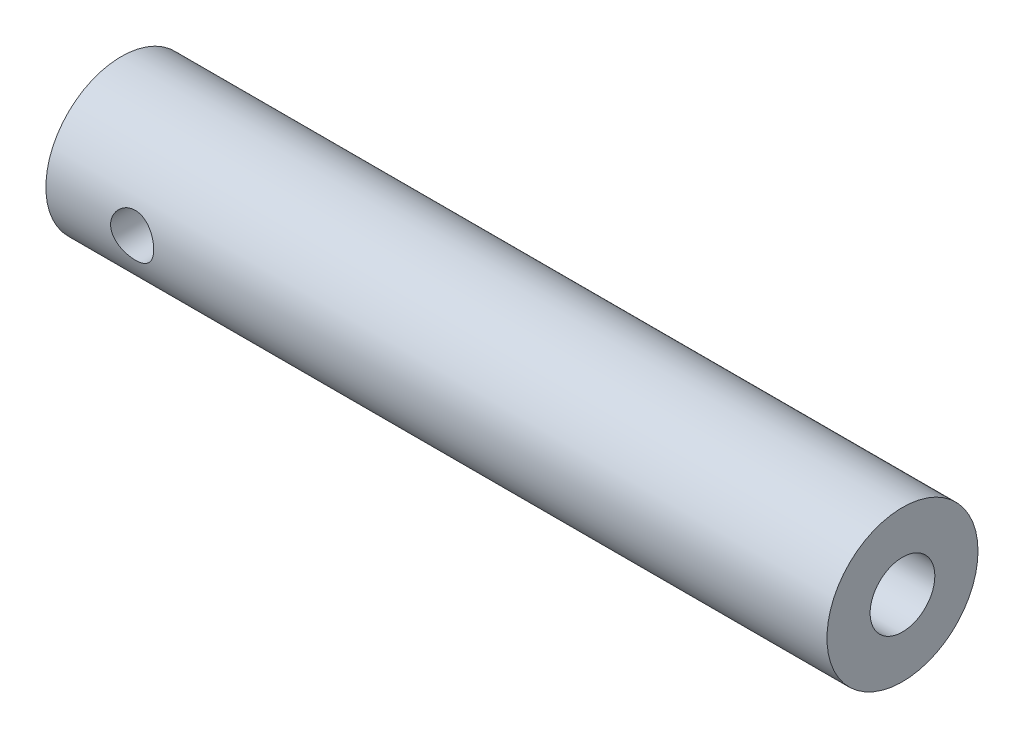
ISO-10303-21;
HEADER;
FILE_DESCRIPTION(('STEP AP214'),'2;1');
FILE_NAME('part.step','',(''),(''),'','','');
FILE_SCHEMA(('AUTOMOTIVE_DESIGN { 1 0 10303 214 1 1 1 1 }'));
ENDSEC;
DATA;
#1=APPLICATION_CONTEXT('core data for automotive mechanical design processes');
#2=APPLICATION_PROTOCOL_DEFINITION('international standard','automotive_design',2000,#1);
#3=PRODUCT_CONTEXT('',#1,'mechanical');
#4=PRODUCT('Part','Part','',(#3));
#5=PRODUCT_RELATED_PRODUCT_CATEGORY('part','',(#4));
#6=PRODUCT_DEFINITION_FORMATION('','',#4);
#7=PRODUCT_DEFINITION_CONTEXT('part definition',#1,'design');
#8=PRODUCT_DEFINITION('design','',#6,#7);
#9=PRODUCT_DEFINITION_SHAPE('','',#8);
#10=(LENGTH_UNIT() NAMED_UNIT(*) SI_UNIT(.MILLI.,.METRE.));
#11=(NAMED_UNIT(*) PLANE_ANGLE_UNIT() SI_UNIT($,.RADIAN.));
#12=(NAMED_UNIT(*) SI_UNIT($,.STERADIAN.) SOLID_ANGLE_UNIT());
#13=UNCERTAINTY_MEASURE_WITH_UNIT(LENGTH_MEASURE(1.E-05),#10,'distance_accuracy_value','');
#14=(GEOMETRIC_REPRESENTATION_CONTEXT(3) GLOBAL_UNCERTAINTY_ASSIGNED_CONTEXT((#13)) GLOBAL_UNIT_ASSIGNED_CONTEXT((#10,
#11,#12)) REPRESENTATION_CONTEXT('',''));
#15=CARTESIAN_POINT('',(0.,0.,0.));
#16=DIRECTION('',(0.,0.,1.));
#17=DIRECTION('',(1.,0.,0.));
#18=AXIS2_PLACEMENT_3D('',#15,#16,#17);
#19=CARTESIAN_POINT('',(181.,0.,0.));
#20=DIRECTION('',(-1.,0.,0.));
#21=DIRECTION('',(0.,0.,1.));
#22=AXIS2_PLACEMENT_3D('',#19,#20,#21);
#23=CYLINDRICAL_SURFACE('',#22,17.5);
#24=CARTESIAN_POINT('',(25.,0.,-17.5));
#25=CARTESIAN_POINT('',(24.9999951510951,0.274887255943128,-17.4999967323586));
#26=CARTESIAN_POINT('',(24.9772555275597,0.549824369681454,-17.4934604350511));
#27=CARTESIAN_POINT('',(24.8870893247442,1.09172997799247,-17.4680226486276));
#28=CARTESIAN_POINT('',(24.8196458348148,1.35869541707404,-17.4491164802521));
#29=CARTESIAN_POINT('',(24.6424799039587,1.87676075184468,-17.4010172837268));
#30=CARTESIAN_POINT('',(24.5328164096201,2.12788220212056,-17.3718386026585));
#31=CARTESIAN_POINT('',(24.2745550213041,2.60817190282318,-17.3062494579136));
#32=CARTESIAN_POINT('',(24.1259530537741,2.83733785294541,-17.2698382377007));
#33=CARTESIAN_POINT('',(23.7899124733177,3.27323611714736,-17.1926183656394));
#34=CARTESIAN_POINT('',(23.6016381153618,3.47930930595233,-17.1517260486293));
#35=CARTESIAN_POINT('',(23.1933806421558,3.85742839481089,-17.0706683728915));
#36=CARTESIAN_POINT('',(22.9733927809195,4.02946919269461,-17.0305031239854));
#37=CARTESIAN_POINT('',(22.5025160430226,4.33799475016071,-16.9545753718829));
#38=CARTESIAN_POINT('',(22.2510950373375,4.47369552758352,-16.9189175626436));
#39=CARTESIAN_POINT('',(21.7278199706235,4.7006292638497,-16.8572835960235));
#40=CARTESIAN_POINT('',(21.4559703198242,4.79187178889368,-16.8313053561473));
#41=CARTESIAN_POINT('',(20.9069130920848,4.92496082534618,-16.7928402048756));
#42=CARTESIAN_POINT('',(20.6300215930753,4.9680138300687,-16.7800244641586));
#43=CARTESIAN_POINT('',(20.0726721288899,5.00726669473215,-16.7683552051416));
#44=CARTESIAN_POINT('',(19.7922149518936,5.00347673524998,-16.7694986530321));
#45=CARTESIAN_POINT('',(19.2453284713328,4.95010336906261,-16.7853258599179));
#46=CARTESIAN_POINT('',(18.9787391219636,4.90200814317314,-16.7995695662338));
#47=CARTESIAN_POINT('',(18.4575819508506,4.76378465210904,-16.8392837083572));
#48=CARTESIAN_POINT('',(18.2030152181801,4.67365258702332,-16.8647551590827));
#49=CARTESIAN_POINT('',(17.7093843889463,4.45276702845641,-16.9244215882328));
#50=CARTESIAN_POINT('',(17.4705573190027,4.32151377932501,-16.95872291023));
#51=CARTESIAN_POINT('',(17.0178085969596,4.02245947919414,-17.0321304219627));
#52=CARTESIAN_POINT('',(16.8038925056608,3.85465029183281,-17.0712376805236));
#53=CARTESIAN_POINT('',(16.398569060986,3.47975999182637,-17.151656266434));
#54=CARTESIAN_POINT('',(16.2083138100825,3.27143718711355,-17.1929951143159));
#55=CARTESIAN_POINT('',(15.8651849908988,2.82533070596534,-17.2719061804519));
#56=CARTESIAN_POINT('',(15.7123133598956,2.58754550370467,-17.3094782034438));
#57=CARTESIAN_POINT('',(15.4476781630651,2.08730768272867,-17.3769132016394));
#58=CARTESIAN_POINT('',(15.3361492829896,1.82472454452503,-17.4067318874312));
#59=CARTESIAN_POINT('',(15.1591652714579,1.28348307491866,-17.4549812871892));
#60=CARTESIAN_POINT('',(15.0936985268868,1.00482881452536,-17.4734148714063));
#61=CARTESIAN_POINT('',(15.0125667857264,0.449165971610878,-17.4963718628669));
#62=CARTESIAN_POINT('',(14.9953382615674,0.172403367151271,-17.501331821265));
#63=CARTESIAN_POINT('',(15.0068181657526,-0.380066317013958,-17.4980521176773));
#64=CARTESIAN_POINT('',(15.0355210821148,-0.65577351939277,-17.4898140395157));
#65=CARTESIAN_POINT('',(15.1367761107906,-1.19254658357579,-17.4613481671302));
#66=CARTESIAN_POINT('',(15.2084329533085,-1.45379552933711,-17.4413653254419));
#67=CARTESIAN_POINT('',(15.3925012549617,-1.9605217155141,-17.3916999685472));
#68=CARTESIAN_POINT('',(15.5049174272233,-2.20599712812179,-17.3620163316471));
#69=CARTESIAN_POINT('',(15.7700583416128,-2.68010421280008,-17.2952490292284));
#70=CARTESIAN_POINT('',(15.9236029970633,-2.90825621635022,-17.2580190794575));
#71=CARTESIAN_POINT('',(16.2656312648777,-3.33609632014869,-17.180448677462));
#72=CARTESIAN_POINT('',(16.4541228251614,-3.53577792710763,-17.1401075188814));
#73=CARTESIAN_POINT('',(16.8680233551237,-3.90776607085016,-17.0592154907323));
#74=CARTESIAN_POINT('',(17.0944381888979,-4.07896356851775,-17.0187009214434));
#75=CARTESIAN_POINT('',(17.5736564715614,-4.380988290169,-16.943472368384));
#76=CARTESIAN_POINT('',(17.8264590019272,-4.51181691871705,-16.9087581828186));
#77=CARTESIAN_POINT('',(18.350228027439,-4.72843635295665,-16.8494662810178));
#78=CARTESIAN_POINT('',(18.6210894087477,-4.81446583099021,-16.8248350005383));
#79=CARTESIAN_POINT('',(19.1742748389333,-4.93948625169788,-16.7885614169356));
#80=CARTESIAN_POINT('',(19.4565953876774,-4.9784914475439,-16.7769151780959));
#81=CARTESIAN_POINT('',(20.0132400823757,-5.00745060616827,-16.7682925774812));
#82=CARTESIAN_POINT('',(20.2874637614812,-4.99920069109392,-16.7707790176036));
#83=CARTESIAN_POINT('',(20.8304368267331,-4.93811777392153,-16.7888649275625));
#84=CARTESIAN_POINT('',(21.0991863952422,-4.88528625949613,-16.8044639598361));
#85=CARTESIAN_POINT('',(21.6209459278904,-4.73764922042289,-16.8466744296963));
#86=CARTESIAN_POINT('',(21.8740884675196,-4.64327729466074,-16.8731719264076));
#87=CARTESIAN_POINT('',(22.3611468362388,-4.41557373253792,-16.9341825708695));
#88=CARTESIAN_POINT('',(22.5950592531853,-4.28223520107836,-16.9686971370099));
#89=CARTESIAN_POINT('',(23.045458804511,-3.97516366337116,-17.0432917237999));
#90=CARTESIAN_POINT('',(23.2611034783543,-3.80023069306842,-17.0835190794904));
#91=CARTESIAN_POINT('',(23.6605597395252,-3.41714960094824,-17.164246127292));
#92=CARTESIAN_POINT('',(23.8443632977772,-3.20899312682136,-17.2047458854255));
#93=CARTESIAN_POINT('',(24.1795929608164,-2.75893580216351,-17.282698989313));
#94=CARTESIAN_POINT('',(24.330067468174,-2.51630625589946,-17.3200475259364));
#95=CARTESIAN_POINT('',(24.5878644625551,-2.00812632411664,-17.3862848944483));
#96=CARTESIAN_POINT('',(24.6952105298327,-1.74258856028684,-17.4151783467569));
#97=CARTESIAN_POINT('',(24.8521188784886,-1.23229078833759,-17.4581836181329));
#98=CARTESIAN_POINT('',(24.9074338417114,-0.989407519060975,-17.473742109052));
#99=CARTESIAN_POINT('',(24.9813741431054,-0.497695921965916,-17.4946510963036));
#100=CARTESIAN_POINT('',(25.0000043899422,-0.248868394040228,-17.5000029583499));
#101=CARTESIAN_POINT('',(25.,0.,-17.5));
#102=B_SPLINE_CURVE_WITH_KNOTS('',3,(#24,#25,#26,#27,#28,#29,#30,#31,#32,#33,#34,#35,#36,#37,
#38,#39,#40,#41,#42,#43,#44,#45,#46,#47,#48,#49,#50,#51,#52,#53,#54,#55,#56,#57,#58,#59,#60,#61,
#62,#63,#64,#65,#66,#67,#68,#69,#70,#71,#72,#73,#74,#75,#76,#77,#78,#79,#80,#81,#82,#83,#84,#85,
#86,#87,#88,#89,#90,#91,#92,#93,#94,#95,#96,#97,#98,#99,#100,#101),.UNSPECIFIED.,.T.,.F.,(4,2,2,
2,2,2,2,2,2,2,2,2,2,2,2,2,2,2,2,2,2,2,2,2,2,2,2,2,2,2,2,2,2,2,2,2,2,2,4),(0.,0.82374828135586,
1.64780834948795,2.47072203223836,3.2937218385879,4.13619528826954,4.97879494684284,
5.83832688250143,6.69767378862023,7.53498774656874,8.37211973078082,9.18211964575845,
9.99219279470076,10.8125200823279,11.6330301394812,12.4844625151101,13.3359390039338,
14.1921775276588,15.0482001004129,15.8761364425026,16.7039734359138,17.5151285120356,
18.3263774144358,19.1551881336589,19.9841875797423,20.840302622156,21.6963878741801,
22.5478643342011,23.399082644741,24.2181670405214,25.0372241048183,25.8479274074505,
26.6587742501083,27.4966914224279,28.3348195778807,29.1944494744229,30.053608731021,
30.7994867011175,31.5452648608618),.UNSPECIFIED.);
#103=CARTESIAN_POINT('',(25.,0.,-17.5));
#104=VERTEX_POINT('',#103);
#105=EDGE_CURVE('E40',#104,#104,#102,.T.);
#106=ORIENTED_EDGE('',*,*,#105,.T.);
#107=EDGE_LOOP('',(#106));
#108=FACE_BOUND('',#107,.T.);
#109=CARTESIAN_POINT('',(25.,0.,17.5));
#110=CARTESIAN_POINT('',(24.9999951510951,-0.274887255943128,17.4999967323586));
#111=CARTESIAN_POINT('',(24.9772555275597,-0.549824369681454,17.4934604350511));
#112=CARTESIAN_POINT('',(24.8870893247442,-1.09172997799247,17.4680226486276));
#113=CARTESIAN_POINT('',(24.8196458348148,-1.35869541707404,17.4491164802521));
#114=CARTESIAN_POINT('',(24.6424799039587,-1.87676075184468,17.4010172837268));
#115=CARTESIAN_POINT('',(24.5328164096201,-2.12788220212056,17.3718386026585));
#116=CARTESIAN_POINT('',(24.2745550213041,-2.60817190282318,17.3062494579136));
#117=CARTESIAN_POINT('',(24.1259530537741,-2.83733785294541,17.2698382377007));
#118=CARTESIAN_POINT('',(23.7899124733177,-3.27323611714736,17.1926183656394));
#119=CARTESIAN_POINT('',(23.6016381153618,-3.47930930595233,17.1517260486293));
#120=CARTESIAN_POINT('',(23.1933806421558,-3.85742839481089,17.0706683728915));
#121=CARTESIAN_POINT('',(22.9733927809195,-4.02946919269461,17.0305031239854));
#122=CARTESIAN_POINT('',(22.5025160430226,-4.33799475016071,16.9545753718829));
#123=CARTESIAN_POINT('',(22.2510950373375,-4.47369552758352,16.9189175626436));
#124=CARTESIAN_POINT('',(21.7278199706235,-4.7006292638497,16.8572835960235));
#125=CARTESIAN_POINT('',(21.4559703198242,-4.79187178889368,16.8313053561473));
#126=CARTESIAN_POINT('',(20.9069130920848,-4.92496082534618,16.7928402048756));
#127=CARTESIAN_POINT('',(20.6300215930753,-4.9680138300687,16.7800244641586));
#128=CARTESIAN_POINT('',(20.0726721288899,-5.00726669473215,16.7683552051416));
#129=CARTESIAN_POINT('',(19.7922149518936,-5.00347673524998,16.7694986530321));
#130=CARTESIAN_POINT('',(19.2453284713328,-4.95010336906261,16.7853258599179));
#131=CARTESIAN_POINT('',(18.9787391219636,-4.90200814317314,16.7995695662338));
#132=CARTESIAN_POINT('',(18.4575819508506,-4.76378465210904,16.8392837083572));
#133=CARTESIAN_POINT('',(18.2030152181801,-4.67365258702332,16.8647551590827));
#134=CARTESIAN_POINT('',(17.7093843889463,-4.45276702845641,16.9244215882328));
#135=CARTESIAN_POINT('',(17.4705573190027,-4.32151377932501,16.95872291023));
#136=CARTESIAN_POINT('',(17.0178085969596,-4.02245947919414,17.0321304219627));
#137=CARTESIAN_POINT('',(16.8038925056608,-3.85465029183281,17.0712376805236));
#138=CARTESIAN_POINT('',(16.398569060986,-3.47975999182637,17.151656266434));
#139=CARTESIAN_POINT('',(16.2083138100825,-3.27143718711355,17.1929951143159));
#140=CARTESIAN_POINT('',(15.8651849908988,-2.82533070596534,17.2719061804519));
#141=CARTESIAN_POINT('',(15.7123133598956,-2.58754550370467,17.3094782034438));
#142=CARTESIAN_POINT('',(15.4476781630651,-2.08730768272867,17.3769132016394));
#143=CARTESIAN_POINT('',(15.3361492829896,-1.82472454452503,17.4067318874312));
#144=CARTESIAN_POINT('',(15.1591652714579,-1.28348307491866,17.4549812871892));
#145=CARTESIAN_POINT('',(15.0936985268868,-1.00482881452536,17.4734148714063));
#146=CARTESIAN_POINT('',(15.0125667857264,-0.449165971610878,17.4963718628669));
#147=CARTESIAN_POINT('',(14.9953382615674,-0.172403367151271,17.501331821265));
#148=CARTESIAN_POINT('',(15.0068181657526,0.380066317013958,17.4980521176773));
#149=CARTESIAN_POINT('',(15.0355210821148,0.65577351939277,17.4898140395157));
#150=CARTESIAN_POINT('',(15.1367761107906,1.19254658357579,17.4613481671302));
#151=CARTESIAN_POINT('',(15.2084329533085,1.45379552933711,17.4413653254419));
#152=CARTESIAN_POINT('',(15.3925012549617,1.9605217155141,17.3916999685472));
#153=CARTESIAN_POINT('',(15.5049174272233,2.20599712812179,17.3620163316471));
#154=CARTESIAN_POINT('',(15.7700583416128,2.68010421280008,17.2952490292284));
#155=CARTESIAN_POINT('',(15.9236029970633,2.90825621635022,17.2580190794575));
#156=CARTESIAN_POINT('',(16.2656312648777,3.33609632014869,17.180448677462));
#157=CARTESIAN_POINT('',(16.4541228251614,3.53577792710763,17.1401075188814));
#158=CARTESIAN_POINT('',(16.8680233551237,3.90776607085016,17.0592154907323));
#159=CARTESIAN_POINT('',(17.0944381888979,4.07896356851775,17.0187009214434));
#160=CARTESIAN_POINT('',(17.5736564715614,4.380988290169,16.943472368384));
#161=CARTESIAN_POINT('',(17.8264590019272,4.51181691871705,16.9087581828186));
#162=CARTESIAN_POINT('',(18.350228027439,4.72843635295665,16.8494662810178));
#163=CARTESIAN_POINT('',(18.6210894087477,4.81446583099021,16.8248350005383));
#164=CARTESIAN_POINT('',(19.1742748389333,4.93948625169788,16.7885614169356));
#165=CARTESIAN_POINT('',(19.4565953876774,4.9784914475439,16.7769151780959));
#166=CARTESIAN_POINT('',(20.0132400823757,5.00745060616827,16.7682925774812));
#167=CARTESIAN_POINT('',(20.2874637614812,4.99920069109392,16.7707790176036));
#168=CARTESIAN_POINT('',(20.8304368267331,4.93811777392153,16.7888649275625));
#169=CARTESIAN_POINT('',(21.0991863952422,4.88528625949613,16.8044639598361));
#170=CARTESIAN_POINT('',(21.6209459278904,4.73764922042289,16.8466744296963));
#171=CARTESIAN_POINT('',(21.8740884675196,4.64327729466074,16.8731719264076));
#172=CARTESIAN_POINT('',(22.3611468362388,4.41557373253792,16.9341825708695));
#173=CARTESIAN_POINT('',(22.5950592531853,4.28223520107836,16.9686971370099));
#174=CARTESIAN_POINT('',(23.045458804511,3.97516366337116,17.0432917237999));
#175=CARTESIAN_POINT('',(23.2611034783543,3.80023069306842,17.0835190794904));
#176=CARTESIAN_POINT('',(23.6605597395252,3.41714960094824,17.164246127292));
#177=CARTESIAN_POINT('',(23.8443632977772,3.20899312682136,17.2047458854255));
#178=CARTESIAN_POINT('',(24.1795929608164,2.75893580216351,17.282698989313));
#179=CARTESIAN_POINT('',(24.330067468174,2.51630625589946,17.3200475259364));
#180=CARTESIAN_POINT('',(24.5878644625551,2.00812632411664,17.3862848944483));
#181=CARTESIAN_POINT('',(24.6952105298327,1.74258856028684,17.4151783467569));
#182=CARTESIAN_POINT('',(24.8521188784886,1.23229078833759,17.4581836181329));
#183=CARTESIAN_POINT('',(24.9074338417114,0.989407519060975,17.473742109052));
#184=CARTESIAN_POINT('',(24.9813741431054,0.497695921965916,17.4946510963036));
#185=CARTESIAN_POINT('',(25.0000043899422,0.248868394040228,17.5000029583499));
#186=CARTESIAN_POINT('',(25.,0.,17.5));
#187=B_SPLINE_CURVE_WITH_KNOTS('',3,(#109,#110,#111,#112,#113,#114,#115,#116,#117,#118,#119,
#120,#121,#122,#123,#124,#125,#126,#127,#128,#129,#130,#131,#132,#133,#134,#135,#136,#137,#138,
#139,#140,#141,#142,#143,#144,#145,#146,#147,#148,#149,#150,#151,#152,#153,#154,#155,#156,#157,
#158,#159,#160,#161,#162,#163,#164,#165,#166,#167,#168,#169,#170,#171,#172,#173,#174,#175,#176,
#177,#178,#179,#180,#181,#182,#183,#184,#185,#186),.UNSPECIFIED.,.T.,.F.,(4,2,2,2,2,2,2,2,2,2,2,
2,2,2,2,2,2,2,2,2,2,2,2,2,2,2,2,2,2,2,2,2,2,2,2,2,2,2,4),(0.,0.82374828135586,1.64780834948795,
2.47072203223836,3.2937218385879,4.13619528826954,4.97879494684284,5.83832688250143,
6.69767378862023,7.53498774656874,8.37211973078082,9.18211964575845,9.99219279470076,
10.8125200823279,11.6330301394812,12.4844625151101,13.3359390039338,14.1921775276588,
15.0482001004129,15.8761364425026,16.7039734359138,17.5151285120356,18.3263774144358,
19.1551881336589,19.9841875797423,20.840302622156,21.6963878741801,22.5478643342011,
23.399082644741,24.2181670405214,25.0372241048183,25.8479274074505,26.6587742501083,
27.4966914224279,28.3348195778807,29.1944494744229,30.053608731021,30.7994867011175,
31.5452648608618),.UNSPECIFIED.);
#188=CARTESIAN_POINT('',(25.,0.,17.5));
#189=VERTEX_POINT('',#188);
#190=EDGE_CURVE('E10',#189,#189,#187,.T.);
#191=ORIENTED_EDGE('',*,*,#190,.T.);
#192=EDGE_LOOP('',(#191));
#193=FACE_BOUND('',#192,.T.);
#194=CARTESIAN_POINT('',(181.,0.,0.));
#195=DIRECTION('',(1.,0.,0.));
#196=DIRECTION('',(0.,0.,-1.));
#197=AXIS2_PLACEMENT_3D('',#194,#195,#196);
#198=CIRCLE('',#197,17.5);
#199=CARTESIAN_POINT('',(181.,0.,-17.5));
#200=VERTEX_POINT('',#199);
#201=EDGE_CURVE('E49',#200,#200,#198,.T.);
#202=ORIENTED_EDGE('',*,*,#201,.F.);
#203=EDGE_LOOP('',(#202));
#204=FACE_BOUND('',#203,.T.);
#205=CARTESIAN_POINT('',(0.,0.,0.));
#206=DIRECTION('',(1.,0.,0.));
#207=DIRECTION('',(0.,0.,-1.));
#208=AXIS2_PLACEMENT_3D('',#205,#206,#207);
#209=CIRCLE('',#208,17.5);
#210=CARTESIAN_POINT('',(0.,0.,-17.5));
#211=VERTEX_POINT('',#210);
#212=EDGE_CURVE('E54',#211,#211,#209,.T.);
#213=ORIENTED_EDGE('',*,*,#212,.T.);
#214=EDGE_LOOP('',(#213));
#215=FACE_BOUND('',#214,.T.);
#216=ADVANCED_FACE('F36',(#108,#193,#204,#215),#23,.T.);
#217=CARTESIAN_POINT('',(181.,0.,0.));
#218=DIRECTION('',(1.,0.,0.));
#219=DIRECTION('',(0.,0.,-1.));
#220=AXIS2_PLACEMENT_3D('',#217,#218,#219);
#221=PLANE('',#220);
#222=CARTESIAN_POINT('',(181.,0.,0.));
#223=DIRECTION('',(1.,0.,0.));
#224=DIRECTION('',(0.,0.,-1.));
#225=AXIS2_PLACEMENT_3D('',#222,#223,#224);
#226=CIRCLE('',#225,7.5);
#227=CARTESIAN_POINT('',(181.,0.,-7.5));
#228=VERTEX_POINT('',#227);
#229=EDGE_CURVE('E90',#228,#228,#226,.T.);
#230=ORIENTED_EDGE('',*,*,#229,.F.);
#231=EDGE_LOOP('',(#230));
#232=FACE_BOUND('',#231,.T.);
#233=ORIENTED_EDGE('',*,*,#201,.T.);
#234=EDGE_LOOP('',(#233));
#235=FACE_BOUND('',#234,.T.);
#236=ADVANCED_FACE('F69',(#232,#235),#221,.T.);
#237=CARTESIAN_POINT('',(0.,0.,0.));
#238=DIRECTION('',(1.,0.,0.));
#239=DIRECTION('',(0.,0.,-1.));
#240=AXIS2_PLACEMENT_3D('',#237,#238,#239);
#241=PLANE('',#240);
#242=ORIENTED_EDGE('',*,*,#212,.F.);
#243=EDGE_LOOP('',(#242));
#244=FACE_BOUND('',#243,.T.);
#245=ADVANCED_FACE('F66',(#244),#241,.F.);
#246=CARTESIAN_POINT('',(20.,0.,-163.5));
#247=DIRECTION('',(0.,0.,1.));
#248=DIRECTION('',(1.,0.,0.));
#249=AXIS2_PLACEMENT_3D('',#246,#247,#248);
#250=CYLINDRICAL_SURFACE('',#249,5.);
#251=ORIENTED_EDGE('',*,*,#105,.F.);
#252=EDGE_LOOP('',(#251));
#253=FACE_BOUND('',#252,.T.);
#254=ORIENTED_EDGE('',*,*,#190,.F.);
#255=EDGE_LOOP('',(#254));
#256=FACE_BOUND('',#255,.T.);
#257=ADVANCED_FACE('F60',(#253,#256),#250,.F.);
#258=CARTESIAN_POINT('',(161.,0.,0.));
#259=DIRECTION('',(1.,0.,0.));
#260=DIRECTION('',(0.,0.,-1.));
#261=AXIS2_PLACEMENT_3D('',#258,#259,#260);
#262=CYLINDRICAL_SURFACE('',#261,7.5);
#263=CARTESIAN_POINT('',(161.,0.,0.));
#264=DIRECTION('',(1.,0.,0.));
#265=DIRECTION('',(0.,0.,-1.));
#266=AXIS2_PLACEMENT_3D('',#263,#264,#265);
#267=CIRCLE('',#266,7.5);
#268=CARTESIAN_POINT('',(161.,0.,-7.5));
#269=VERTEX_POINT('',#268);
#270=EDGE_CURVE('E93',#269,#269,#267,.T.);
#271=ORIENTED_EDGE('',*,*,#270,.F.);
#272=EDGE_LOOP('',(#271));
#273=FACE_BOUND('',#272,.T.);
#274=ORIENTED_EDGE('',*,*,#229,.T.);
#275=EDGE_LOOP('',(#274));
#276=FACE_BOUND('',#275,.T.);
#277=ADVANCED_FACE('F65',(#273,#276),#262,.F.);
#278=CARTESIAN_POINT('',(141.,0.,0.));
#279=DIRECTION('',(1.,0.,0.));
#280=DIRECTION('',(0.,0.,-1.));
#281=AXIS2_PLACEMENT_3D('',#278,#279,#280);
#282=CYLINDRICAL_SURFACE('',#281,12.5);
#283=CARTESIAN_POINT('',(141.,0.,0.));
#284=DIRECTION('',(1.,0.,0.));
#285=DIRECTION('',(0.,0.,-1.));
#286=AXIS2_PLACEMENT_3D('',#283,#284,#285);
#287=CIRCLE('',#286,12.5);
#288=CARTESIAN_POINT('',(141.,0.,-12.5));
#289=VERTEX_POINT('',#288);
#290=EDGE_CURVE('E99',#289,#289,#287,.T.);
#291=ORIENTED_EDGE('',*,*,#290,.F.);
#292=EDGE_LOOP('',(#291));
#293=FACE_BOUND('',#292,.T.);
#294=CARTESIAN_POINT('',(161.,0.,0.));
#295=DIRECTION('',(1.,0.,0.));
#296=DIRECTION('',(0.,0.,-1.));
#297=AXIS2_PLACEMENT_3D('',#294,#295,#296);
#298=CIRCLE('',#297,12.5);
#299=CARTESIAN_POINT('',(161.,0.,-12.5));
#300=VERTEX_POINT('',#299);
#301=EDGE_CURVE('E102',#300,#300,#298,.T.);
#302=ORIENTED_EDGE('',*,*,#301,.T.);
#303=EDGE_LOOP('',(#302));
#304=FACE_BOUND('',#303,.T.);
#305=ADVANCED_FACE('F112',(#293,#304),#282,.F.);
#306=CARTESIAN_POINT('',(141.,0.,0.));
#307=DIRECTION('',(1.,0.,0.));
#308=DIRECTION('',(0.,0.,-1.));
#309=AXIS2_PLACEMENT_3D('',#306,#307,#308);
#310=PLANE('',#309);
#311=ORIENTED_EDGE('',*,*,#290,.T.);
#312=EDGE_LOOP('',(#311));
#313=FACE_BOUND('',#312,.T.);
#314=ADVANCED_FACE('F110',(#313),#310,.T.);
#315=CARTESIAN_POINT('',(161.,0.,0.));
#316=DIRECTION('',(1.,0.,0.));
#317=DIRECTION('',(0.,0.,-1.));
#318=AXIS2_PLACEMENT_3D('',#315,#316,#317);
#319=PLANE('',#318);
#320=ORIENTED_EDGE('',*,*,#270,.T.);
#321=EDGE_LOOP('',(#320));
#322=FACE_BOUND('',#321,.T.);
#323=ORIENTED_EDGE('',*,*,#301,.F.);
#324=EDGE_LOOP('',(#323));
#325=FACE_BOUND('',#324,.T.);
#326=ADVANCED_FACE('F117',(#322,#325),#319,.F.);
#327=CLOSED_SHELL('',(#216,#236,#245,#257,#277,#305,#314,#326));
#328=MANIFOLD_SOLID_BREP('B2',#327);
#329=ADVANCED_BREP_SHAPE_REPRESENTATION('',(#18,#328),#14);
#330=SHAPE_DEFINITION_REPRESENTATION(#9,#329);
ENDSEC;
END-ISO-10303-21;
